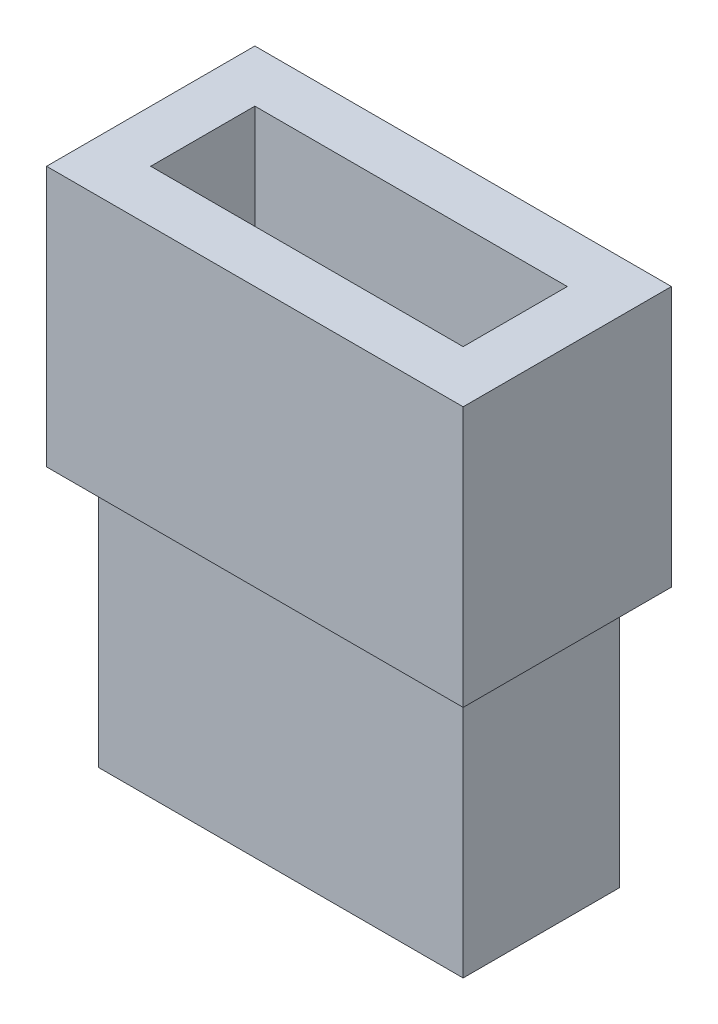
ISO-10303-21;
HEADER;
FILE_DESCRIPTION(('STEP AP214'),'2;1');
FILE_NAME('part.step','',(''),(''),'','','');
FILE_SCHEMA(('AUTOMOTIVE_DESIGN { 1 0 10303 214 1 1 1 1 }'));
ENDSEC;
DATA;
#1=APPLICATION_CONTEXT('core data for automotive mechanical design processes');
#2=APPLICATION_PROTOCOL_DEFINITION('international standard','automotive_design',2000,#1);
#3=PRODUCT_CONTEXT('',#1,'mechanical');
#4=PRODUCT('Part','Part','',(#3));
#5=PRODUCT_RELATED_PRODUCT_CATEGORY('part','',(#4));
#6=PRODUCT_DEFINITION_FORMATION('','',#4);
#7=PRODUCT_DEFINITION_CONTEXT('part definition',#1,'design');
#8=PRODUCT_DEFINITION('design','',#6,#7);
#9=PRODUCT_DEFINITION_SHAPE('','',#8);
#10=(LENGTH_UNIT() NAMED_UNIT(*) SI_UNIT(.MILLI.,.METRE.));
#11=(NAMED_UNIT(*) PLANE_ANGLE_UNIT() SI_UNIT($,.RADIAN.));
#12=(NAMED_UNIT(*) SI_UNIT($,.STERADIAN.) SOLID_ANGLE_UNIT());
#13=UNCERTAINTY_MEASURE_WITH_UNIT(LENGTH_MEASURE(1.E-05),#10,'distance_accuracy_value','');
#14=(GEOMETRIC_REPRESENTATION_CONTEXT(3) GLOBAL_UNCERTAINTY_ASSIGNED_CONTEXT((#13)) GLOBAL_UNIT_ASSIGNED_CONTEXT((#10,
#11,#12)) REPRESENTATION_CONTEXT('',''));
#15=CARTESIAN_POINT('',(0.,0.,0.));
#16=DIRECTION('',(0.,0.,1.));
#17=DIRECTION('',(1.,0.,0.));
#18=AXIS2_PLACEMENT_3D('',#15,#16,#17);
#19=CARTESIAN_POINT('',(0.,0.,0.));
#20=DIRECTION('',(0.,1.,0.));
#21=DIRECTION('',(0.,0.,1.));
#22=AXIS2_PLACEMENT_3D('',#19,#20,#21);
#23=PLANE('',#22);
#24=DIRECTION('',(1.,0.,0.));
#25=VECTOR('',#24,1.);
#26=CARTESIAN_POINT('',(0.,0.,10.));
#27=LINE('',#26,#25);
#28=CARTESIAN_POINT('',(-20.,0.,10.));
#29=VERTEX_POINT('',#28);
#30=CARTESIAN_POINT('',(20.,0.,10.));
#31=VERTEX_POINT('',#30);
#32=EDGE_CURVE('E141',#29,#31,#27,.T.);
#33=ORIENTED_EDGE('',*,*,#32,.F.);
#34=DIRECTION('',(0.,0.,-1.));
#35=VECTOR('',#34,1.);
#36=CARTESIAN_POINT('',(-20.,0.,0.));
#37=LINE('',#36,#35);
#38=CARTESIAN_POINT('',(-20.,0.,-10.));
#39=VERTEX_POINT('',#38);
#40=EDGE_CURVE('E147',#29,#39,#37,.T.);
#41=ORIENTED_EDGE('',*,*,#40,.T.);
#42=DIRECTION('',(1.,0.,0.));
#43=VECTOR('',#42,1.);
#44=CARTESIAN_POINT('',(0.,0.,-10.));
#45=LINE('',#44,#43);
#46=CARTESIAN_POINT('',(20.,0.,-10.));
#47=VERTEX_POINT('',#46);
#48=EDGE_CURVE('E145',#39,#47,#45,.T.);
#49=ORIENTED_EDGE('',*,*,#48,.T.);
#50=DIRECTION('',(0.,0.,-1.));
#51=VECTOR('',#50,1.);
#52=CARTESIAN_POINT('',(20.,0.,0.));
#53=LINE('',#52,#51);
#54=EDGE_CURVE('E128',#31,#47,#53,.T.);
#55=ORIENTED_EDGE('',*,*,#54,.F.);
#56=EDGE_LOOP('',(#33,#41,#49,#55));
#57=FACE_BOUND('',#56,.T.);
#58=DIRECTION('',(0.,0.,-1.));
#59=VECTOR('',#58,1.);
#60=CARTESIAN_POINT('',(-17.5,0.,0.));
#61=LINE('',#60,#59);
#62=CARTESIAN_POINT('',(-17.5,0.,7.5));
#63=VERTEX_POINT('',#62);
#64=CARTESIAN_POINT('',(-17.5,0.,-7.5));
#65=VERTEX_POINT('',#64);
#66=EDGE_CURVE('E206',#63,#65,#61,.T.);
#67=ORIENTED_EDGE('',*,*,#66,.F.);
#68=DIRECTION('',(1.,0.,0.));
#69=VECTOR('',#68,1.);
#70=CARTESIAN_POINT('',(0.,0.,7.5));
#71=LINE('',#70,#69);
#72=CARTESIAN_POINT('',(17.5,0.,7.5));
#73=VERTEX_POINT('',#72);
#74=EDGE_CURVE('E209',#63,#73,#71,.T.);
#75=ORIENTED_EDGE('',*,*,#74,.T.);
#76=DIRECTION('',(0.,0.,-1.));
#77=VECTOR('',#76,1.);
#78=CARTESIAN_POINT('',(17.5,0.,0.));
#79=LINE('',#78,#77);
#80=CARTESIAN_POINT('',(17.5,0.,-7.5));
#81=VERTEX_POINT('',#80);
#82=EDGE_CURVE('E60',#73,#81,#79,.T.);
#83=ORIENTED_EDGE('',*,*,#82,.T.);
#84=DIRECTION('',(1.,0.,0.));
#85=VECTOR('',#84,1.);
#86=CARTESIAN_POINT('',(0.,0.,-7.5));
#87=LINE('',#86,#85);
#88=EDGE_CURVE('E185',#65,#81,#87,.T.);
#89=ORIENTED_EDGE('',*,*,#88,.F.);
#90=EDGE_LOOP('',(#67,#75,#83,#89));
#91=FACE_BOUND('',#90,.T.);
#92=ADVANCED_FACE('F43',(#57,#91),#23,.F.);
#93=CARTESIAN_POINT('',(0.,25.,10.));
#94=DIRECTION('',(0.,0.,-1.));
#95=DIRECTION('',(-1.,0.,0.));
#96=AXIS2_PLACEMENT_3D('',#93,#94,#95);
#97=PLANE('',#96);
#98=ORIENTED_EDGE('',*,*,#32,.T.);
#99=DIRECTION('',(0.,-1.,0.));
#100=VECTOR('',#99,1.);
#101=CARTESIAN_POINT('',(20.,25.,10.));
#102=LINE('',#101,#100);
#103=CARTESIAN_POINT('',(20.,25.,10.));
#104=VERTEX_POINT('',#103);
#105=EDGE_CURVE('E11',#104,#31,#102,.T.);
#106=ORIENTED_EDGE('',*,*,#105,.F.);
#107=DIRECTION('',(1.,0.,0.));
#108=VECTOR('',#107,1.);
#109=CARTESIAN_POINT('',(0.,25.,10.));
#110=LINE('',#109,#108);
#111=CARTESIAN_POINT('',(-20.,25.,10.));
#112=VERTEX_POINT('',#111);
#113=EDGE_CURVE('E122',#112,#104,#110,.T.);
#114=ORIENTED_EDGE('',*,*,#113,.F.);
#115=DIRECTION('',(0.,-1.,0.));
#116=VECTOR('',#115,1.);
#117=CARTESIAN_POINT('',(-20.,25.,10.));
#118=LINE('',#117,#116);
#119=EDGE_CURVE('E69',#112,#29,#118,.T.);
#120=ORIENTED_EDGE('',*,*,#119,.T.);
#121=EDGE_LOOP('',(#98,#106,#114,#120));
#122=FACE_BOUND('',#121,.T.);
#123=ADVANCED_FACE('F271',(#122),#97,.F.);
#124=CARTESIAN_POINT('',(20.,25.,0.));
#125=DIRECTION('',(-1.,0.,0.));
#126=DIRECTION('',(0.,0.,1.));
#127=AXIS2_PLACEMENT_3D('',#124,#125,#126);
#128=PLANE('',#127);
#129=ORIENTED_EDGE('',*,*,#54,.T.);
#130=DIRECTION('',(0.,-1.,0.));
#131=VECTOR('',#130,1.);
#132=CARTESIAN_POINT('',(20.,25.,-10.));
#133=LINE('',#132,#131);
#134=CARTESIAN_POINT('',(20.,25.,-10.));
#135=VERTEX_POINT('',#134);
#136=EDGE_CURVE('E52',#135,#47,#133,.T.);
#137=ORIENTED_EDGE('',*,*,#136,.F.);
#138=DIRECTION('',(0.,0.,-1.));
#139=VECTOR('',#138,1.);
#140=CARTESIAN_POINT('',(20.,25.,0.));
#141=LINE('',#140,#139);
#142=EDGE_CURVE('E116',#104,#135,#141,.T.);
#143=ORIENTED_EDGE('',*,*,#142,.F.);
#144=ORIENTED_EDGE('',*,*,#105,.T.);
#145=EDGE_LOOP('',(#129,#137,#143,#144));
#146=FACE_BOUND('',#145,.T.);
#147=ADVANCED_FACE('F127',(#146),#128,.F.);
#148=CARTESIAN_POINT('',(0.,25.,-10.));
#149=DIRECTION('',(0.,0.,-1.));
#150=DIRECTION('',(-1.,0.,0.));
#151=AXIS2_PLACEMENT_3D('',#148,#149,#150);
#152=PLANE('',#151);
#153=ORIENTED_EDGE('',*,*,#48,.F.);
#154=DIRECTION('',(0.,-1.,0.));
#155=VECTOR('',#154,1.);
#156=CARTESIAN_POINT('',(-20.,25.,-10.));
#157=LINE('',#156,#155);
#158=CARTESIAN_POINT('',(-20.,25.,-10.));
#159=VERTEX_POINT('',#158);
#160=EDGE_CURVE('E132',#159,#39,#157,.T.);
#161=ORIENTED_EDGE('',*,*,#160,.F.);
#162=DIRECTION('',(1.,0.,0.));
#163=VECTOR('',#162,1.);
#164=CARTESIAN_POINT('',(0.,25.,-10.));
#165=LINE('',#164,#163);
#166=EDGE_CURVE('E121',#159,#135,#165,.T.);
#167=ORIENTED_EDGE('',*,*,#166,.T.);
#168=ORIENTED_EDGE('',*,*,#136,.T.);
#169=EDGE_LOOP('',(#153,#161,#167,#168));
#170=FACE_BOUND('',#169,.T.);
#171=ADVANCED_FACE('F134',(#170),#152,.T.);
#172=CARTESIAN_POINT('',(15.,25.,0.));
#173=DIRECTION('',(-1.,0.,0.));
#174=DIRECTION('',(0.,0.,1.));
#175=AXIS2_PLACEMENT_3D('',#172,#173,#174);
#176=PLANE('',#175);
#177=DIRECTION('',(0.,-1.,0.));
#178=VECTOR('',#177,1.);
#179=CARTESIAN_POINT('',(15.,25.,-5.));
#180=LINE('',#179,#178);
#181=CARTESIAN_POINT('',(15.,25.,-5.));
#182=VERTEX_POINT('',#181);
#183=CARTESIAN_POINT('',(15.,-25.,-5.));
#184=VERTEX_POINT('',#183);
#185=EDGE_CURVE('E137',#182,#184,#180,.T.);
#186=ORIENTED_EDGE('',*,*,#185,.T.);
#187=DIRECTION('',(0.,0.,-1.));
#188=VECTOR('',#187,1.);
#189=CARTESIAN_POINT('',(15.,-25.,0.));
#190=LINE('',#189,#188);
#191=CARTESIAN_POINT('',(15.,-25.,5.));
#192=VERTEX_POINT('',#191);
#193=EDGE_CURVE('E180',#192,#184,#190,.T.);
#194=ORIENTED_EDGE('',*,*,#193,.F.);
#195=DIRECTION('',(0.,-1.,0.));
#196=VECTOR('',#195,1.);
#197=CARTESIAN_POINT('',(15.,25.,5.));
#198=LINE('',#197,#196);
#199=CARTESIAN_POINT('',(15.,25.,5.));
#200=VERTEX_POINT('',#199);
#201=EDGE_CURVE('E47',#200,#192,#198,.T.);
#202=ORIENTED_EDGE('',*,*,#201,.F.);
#203=DIRECTION('',(0.,0.,-1.));
#204=VECTOR('',#203,1.);
#205=CARTESIAN_POINT('',(15.,25.,0.));
#206=LINE('',#205,#204);
#207=EDGE_CURVE('E150',#200,#182,#206,.T.);
#208=ORIENTED_EDGE('',*,*,#207,.T.);
#209=EDGE_LOOP('',(#186,#194,#202,#208));
#210=FACE_BOUND('',#209,.T.);
#211=ADVANCED_FACE('F45',(#210),#176,.T.);
#212=CARTESIAN_POINT('',(0.,25.,5.));
#213=DIRECTION('',(0.,0.,-1.));
#214=DIRECTION('',(-1.,0.,0.));
#215=AXIS2_PLACEMENT_3D('',#212,#213,#214);
#216=PLANE('',#215);
#217=ORIENTED_EDGE('',*,*,#201,.T.);
#218=DIRECTION('',(1.,0.,0.));
#219=VECTOR('',#218,1.);
#220=CARTESIAN_POINT('',(0.,-25.,5.));
#221=LINE('',#220,#219);
#222=CARTESIAN_POINT('',(-15.,-25.,5.));
#223=VERTEX_POINT('',#222);
#224=EDGE_CURVE('E169',#223,#192,#221,.T.);
#225=ORIENTED_EDGE('',*,*,#224,.F.);
#226=DIRECTION('',(0.,-1.,0.));
#227=VECTOR('',#226,1.);
#228=CARTESIAN_POINT('',(-15.,25.,5.));
#229=LINE('',#228,#227);
#230=CARTESIAN_POINT('',(-15.,25.,5.));
#231=VERTEX_POINT('',#230);
#232=EDGE_CURVE('E157',#231,#223,#229,.T.);
#233=ORIENTED_EDGE('',*,*,#232,.F.);
#234=DIRECTION('',(1.,0.,0.));
#235=VECTOR('',#234,1.);
#236=CARTESIAN_POINT('',(0.,25.,5.));
#237=LINE('',#236,#235);
#238=EDGE_CURVE('E172',#231,#200,#237,.T.);
#239=ORIENTED_EDGE('',*,*,#238,.T.);
#240=EDGE_LOOP('',(#217,#225,#233,#239));
#241=FACE_BOUND('',#240,.T.);
#242=ADVANCED_FACE('F168',(#241),#216,.T.);
#243=CARTESIAN_POINT('',(-15.,25.,0.));
#244=DIRECTION('',(-1.,0.,0.));
#245=DIRECTION('',(0.,0.,1.));
#246=AXIS2_PLACEMENT_3D('',#243,#244,#245);
#247=PLANE('',#246);
#248=ORIENTED_EDGE('',*,*,#232,.T.);
#249=DIRECTION('',(0.,0.,-1.));
#250=VECTOR('',#249,1.);
#251=CARTESIAN_POINT('',(-15.,-25.,0.));
#252=LINE('',#251,#250);
#253=CARTESIAN_POINT('',(-15.,-25.,-5.));
#254=VERTEX_POINT('',#253);
#255=EDGE_CURVE('E182',#223,#254,#252,.T.);
#256=ORIENTED_EDGE('',*,*,#255,.T.);
#257=DIRECTION('',(0.,-1.,0.));
#258=VECTOR('',#257,1.);
#259=CARTESIAN_POINT('',(-15.,25.,-5.));
#260=LINE('',#259,#258);
#261=CARTESIAN_POINT('',(-15.,25.,-5.));
#262=VERTEX_POINT('',#261);
#263=EDGE_CURVE('E155',#262,#254,#260,.T.);
#264=ORIENTED_EDGE('',*,*,#263,.F.);
#265=DIRECTION('',(0.,0.,-1.));
#266=VECTOR('',#265,1.);
#267=CARTESIAN_POINT('',(-15.,25.,0.));
#268=LINE('',#267,#266);
#269=EDGE_CURVE('E223',#231,#262,#268,.T.);
#270=ORIENTED_EDGE('',*,*,#269,.F.);
#271=EDGE_LOOP('',(#248,#256,#264,#270));
#272=FACE_BOUND('',#271,.T.);
#273=ADVANCED_FACE('F292',(#272),#247,.F.);
#274=CARTESIAN_POINT('',(0.,25.,-5.));
#275=DIRECTION('',(0.,0.,-1.));
#276=DIRECTION('',(-1.,0.,0.));
#277=AXIS2_PLACEMENT_3D('',#274,#275,#276);
#278=PLANE('',#277);
#279=ORIENTED_EDGE('',*,*,#263,.T.);
#280=DIRECTION('',(1.,0.,0.));
#281=VECTOR('',#280,1.);
#282=CARTESIAN_POINT('',(0.,-25.,-5.));
#283=LINE('',#282,#281);
#284=EDGE_CURVE('E191',#254,#184,#283,.T.);
#285=ORIENTED_EDGE('',*,*,#284,.T.);
#286=ORIENTED_EDGE('',*,*,#185,.F.);
#287=DIRECTION('',(1.,0.,0.));
#288=VECTOR('',#287,1.);
#289=CARTESIAN_POINT('',(0.,25.,-5.));
#290=LINE('',#289,#288);
#291=EDGE_CURVE('E225',#262,#182,#290,.T.);
#292=ORIENTED_EDGE('',*,*,#291,.F.);
#293=EDGE_LOOP('',(#279,#285,#286,#292));
#294=FACE_BOUND('',#293,.T.);
#295=ADVANCED_FACE('F230',(#294),#278,.F.);
#296=CARTESIAN_POINT('',(-20.,25.,0.));
#297=DIRECTION('',(-1.,0.,0.));
#298=DIRECTION('',(0.,0.,1.));
#299=AXIS2_PLACEMENT_3D('',#296,#297,#298);
#300=PLANE('',#299);
#301=ORIENTED_EDGE('',*,*,#40,.F.);
#302=ORIENTED_EDGE('',*,*,#119,.F.);
#303=DIRECTION('',(0.,0.,-1.));
#304=VECTOR('',#303,1.);
#305=CARTESIAN_POINT('',(-20.,25.,0.));
#306=LINE('',#305,#304);
#307=EDGE_CURVE('E135',#112,#159,#306,.T.);
#308=ORIENTED_EDGE('',*,*,#307,.T.);
#309=ORIENTED_EDGE('',*,*,#160,.T.);
#310=EDGE_LOOP('',(#301,#302,#308,#309));
#311=FACE_BOUND('',#310,.T.);
#312=ADVANCED_FACE('F283',(#311),#300,.T.);
#313=CARTESIAN_POINT('',(0.,25.,0.));
#314=DIRECTION('',(0.,1.,0.));
#315=DIRECTION('',(0.,0.,1.));
#316=AXIS2_PLACEMENT_3D('',#313,#314,#315);
#317=PLANE('',#316);
#318=ORIENTED_EDGE('',*,*,#207,.F.);
#319=ORIENTED_EDGE('',*,*,#238,.F.);
#320=ORIENTED_EDGE('',*,*,#269,.T.);
#321=ORIENTED_EDGE('',*,*,#291,.T.);
#322=EDGE_LOOP('',(#318,#319,#320,#321));
#323=FACE_BOUND('',#322,.T.);
#324=ORIENTED_EDGE('',*,*,#113,.T.);
#325=ORIENTED_EDGE('',*,*,#142,.T.);
#326=ORIENTED_EDGE('',*,*,#166,.F.);
#327=ORIENTED_EDGE('',*,*,#307,.F.);
#328=EDGE_LOOP('',(#324,#325,#326,#327));
#329=FACE_BOUND('',#328,.T.);
#330=ADVANCED_FACE('F118',(#323,#329),#317,.T.);
#331=CARTESIAN_POINT('',(-17.5,-25.,0.));
#332=DIRECTION('',(1.,0.,0.));
#333=DIRECTION('',(0.,0.,-1.));
#334=AXIS2_PLACEMENT_3D('',#331,#332,#333);
#335=PLANE('',#334);
#336=ORIENTED_EDGE('',*,*,#66,.T.);
#337=DIRECTION('',(0.,1.,0.));
#338=VECTOR('',#337,1.);
#339=CARTESIAN_POINT('',(-17.5,-25.,-7.5));
#340=LINE('',#339,#338);
#341=CARTESIAN_POINT('',(-17.5,-25.,-7.5));
#342=VERTEX_POINT('',#341);
#343=EDGE_CURVE('E143',#342,#65,#340,.T.);
#344=ORIENTED_EDGE('',*,*,#343,.F.);
#345=DIRECTION('',(0.,0.,-1.));
#346=VECTOR('',#345,1.);
#347=CARTESIAN_POINT('',(-17.5,-25.,0.));
#348=LINE('',#347,#346);
#349=CARTESIAN_POINT('',(-17.5,-25.,7.5));
#350=VERTEX_POINT('',#349);
#351=EDGE_CURVE('E193',#350,#342,#348,.T.);
#352=ORIENTED_EDGE('',*,*,#351,.F.);
#353=DIRECTION('',(0.,1.,0.));
#354=VECTOR('',#353,1.);
#355=CARTESIAN_POINT('',(-17.5,-25.,7.5));
#356=LINE('',#355,#354);
#357=EDGE_CURVE('E205',#350,#63,#356,.T.);
#358=ORIENTED_EDGE('',*,*,#357,.T.);
#359=EDGE_LOOP('',(#336,#344,#352,#358));
#360=FACE_BOUND('',#359,.T.);
#361=ADVANCED_FACE('F255',(#360),#335,.F.);
#362=CARTESIAN_POINT('',(0.,-25.,-7.5));
#363=DIRECTION('',(0.,0.,1.));
#364=DIRECTION('',(1.,0.,0.));
#365=AXIS2_PLACEMENT_3D('',#362,#363,#364);
#366=PLANE('',#365);
#367=ORIENTED_EDGE('',*,*,#88,.T.);
#368=DIRECTION('',(0.,1.,0.));
#369=VECTOR('',#368,1.);
#370=CARTESIAN_POINT('',(17.5,-25.,-7.5));
#371=LINE('',#370,#369);
#372=CARTESIAN_POINT('',(17.5,-25.,-7.5));
#373=VERTEX_POINT('',#372);
#374=EDGE_CURVE('E215',#373,#81,#371,.T.);
#375=ORIENTED_EDGE('',*,*,#374,.F.);
#376=DIRECTION('',(1.,0.,0.));
#377=VECTOR('',#376,1.);
#378=CARTESIAN_POINT('',(0.,-25.,-7.5));
#379=LINE('',#378,#377);
#380=EDGE_CURVE('E202',#342,#373,#379,.T.);
#381=ORIENTED_EDGE('',*,*,#380,.F.);
#382=ORIENTED_EDGE('',*,*,#343,.T.);
#383=EDGE_LOOP('',(#367,#375,#381,#382));
#384=FACE_BOUND('',#383,.T.);
#385=ADVANCED_FACE('F250',(#384),#366,.F.);
#386=CARTESIAN_POINT('',(17.5,-25.,0.));
#387=DIRECTION('',(1.,0.,0.));
#388=DIRECTION('',(0.,0.,-1.));
#389=AXIS2_PLACEMENT_3D('',#386,#387,#388);
#390=PLANE('',#389);
#391=ORIENTED_EDGE('',*,*,#82,.F.);
#392=DIRECTION('',(0.,1.,0.));
#393=VECTOR('',#392,1.);
#394=CARTESIAN_POINT('',(17.5,-25.,7.5));
#395=LINE('',#394,#393);
#396=CARTESIAN_POINT('',(17.5,-25.,7.5));
#397=VERTEX_POINT('',#396);
#398=EDGE_CURVE('E217',#397,#73,#395,.T.);
#399=ORIENTED_EDGE('',*,*,#398,.F.);
#400=DIRECTION('',(0.,0.,-1.));
#401=VECTOR('',#400,1.);
#402=CARTESIAN_POINT('',(17.5,-25.,0.));
#403=LINE('',#402,#401);
#404=EDGE_CURVE('E199',#397,#373,#403,.T.);
#405=ORIENTED_EDGE('',*,*,#404,.T.);
#406=ORIENTED_EDGE('',*,*,#374,.T.);
#407=EDGE_LOOP('',(#391,#399,#405,#406));
#408=FACE_BOUND('',#407,.T.);
#409=ADVANCED_FACE('F262',(#408),#390,.T.);
#410=CARTESIAN_POINT('',(0.,-25.,7.5));
#411=DIRECTION('',(0.,0.,1.));
#412=DIRECTION('',(1.,0.,0.));
#413=AXIS2_PLACEMENT_3D('',#410,#411,#412);
#414=PLANE('',#413);
#415=ORIENTED_EDGE('',*,*,#74,.F.);
#416=ORIENTED_EDGE('',*,*,#357,.F.);
#417=DIRECTION('',(1.,0.,0.));
#418=VECTOR('',#417,1.);
#419=CARTESIAN_POINT('',(0.,-25.,7.5));
#420=LINE('',#419,#418);
#421=EDGE_CURVE('E196',#350,#397,#420,.T.);
#422=ORIENTED_EDGE('',*,*,#421,.T.);
#423=ORIENTED_EDGE('',*,*,#398,.T.);
#424=EDGE_LOOP('',(#415,#416,#422,#423));
#425=FACE_BOUND('',#424,.T.);
#426=ADVANCED_FACE('F259',(#425),#414,.T.);
#427=CARTESIAN_POINT('',(0.,-25.,0.));
#428=DIRECTION('',(0.,1.,0.));
#429=DIRECTION('',(0.,0.,1.));
#430=AXIS2_PLACEMENT_3D('',#427,#428,#429);
#431=PLANE('',#430);
#432=ORIENTED_EDGE('',*,*,#193,.T.);
#433=ORIENTED_EDGE('',*,*,#284,.F.);
#434=ORIENTED_EDGE('',*,*,#255,.F.);
#435=ORIENTED_EDGE('',*,*,#224,.T.);
#436=EDGE_LOOP('',(#432,#433,#434,#435));
#437=FACE_BOUND('',#436,.T.);
#438=ORIENTED_EDGE('',*,*,#351,.T.);
#439=ORIENTED_EDGE('',*,*,#380,.T.);
#440=ORIENTED_EDGE('',*,*,#404,.F.);
#441=ORIENTED_EDGE('',*,*,#421,.F.);
#442=EDGE_LOOP('',(#438,#439,#440,#441));
#443=FACE_BOUND('',#442,.T.);
#444=ADVANCED_FACE('F176',(#437,#443),#431,.F.);
#445=CLOSED_SHELL('',(#92,#123,#147,#171,#211,#242,#273,#295,#312,#330,#361,#385,#409,#426,#444));
#446=MANIFOLD_SOLID_BREP('B2',#445);
#447=ADVANCED_BREP_SHAPE_REPRESENTATION('',(#18,#446),#14);
#448=SHAPE_DEFINITION_REPRESENTATION(#9,#447);
ENDSEC;
END-ISO-10303-21;
